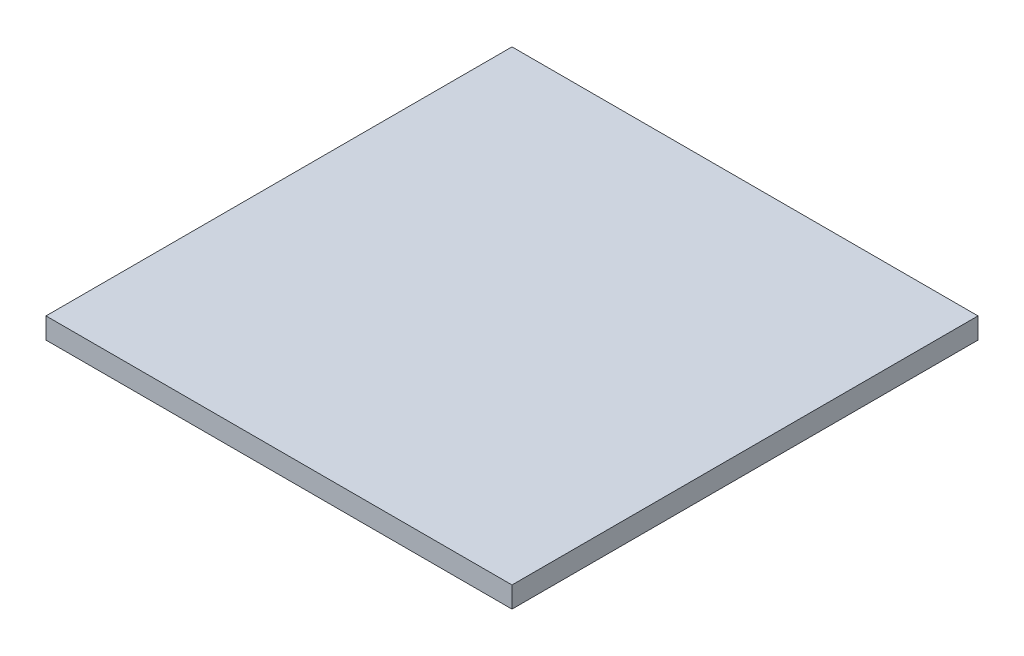
ISO-10303-21;
HEADER;
FILE_DESCRIPTION(('STEP AP214'),'2;1');
FILE_NAME('part.step','',(''),(''),'','','');
FILE_SCHEMA(('AUTOMOTIVE_DESIGN { 1 0 10303 214 1 1 1 1 }'));
ENDSEC;
DATA;
#1=APPLICATION_CONTEXT('core data for automotive mechanical design processes');
#2=APPLICATION_PROTOCOL_DEFINITION('international standard','automotive_design',2000,#1);
#3=PRODUCT_CONTEXT('',#1,'mechanical');
#4=PRODUCT('Part','Part','',(#3));
#5=PRODUCT_RELATED_PRODUCT_CATEGORY('part','',(#4));
#6=PRODUCT_DEFINITION_FORMATION('','',#4);
#7=PRODUCT_DEFINITION_CONTEXT('part definition',#1,'design');
#8=PRODUCT_DEFINITION('design','',#6,#7);
#9=PRODUCT_DEFINITION_SHAPE('','',#8);
#10=(LENGTH_UNIT() NAMED_UNIT(*) SI_UNIT(.MILLI.,.METRE.));
#11=(NAMED_UNIT(*) PLANE_ANGLE_UNIT() SI_UNIT($,.RADIAN.));
#12=(NAMED_UNIT(*) SI_UNIT($,.STERADIAN.) SOLID_ANGLE_UNIT());
#13=UNCERTAINTY_MEASURE_WITH_UNIT(LENGTH_MEASURE(1.E-05),#10,'distance_accuracy_value','');
#14=(GEOMETRIC_REPRESENTATION_CONTEXT(3) GLOBAL_UNCERTAINTY_ASSIGNED_CONTEXT((#13)) GLOBAL_UNIT_ASSIGNED_CONTEXT((#10,
#11,#12)) REPRESENTATION_CONTEXT('',''));
#15=CARTESIAN_POINT('',(0.,0.,0.));
#16=DIRECTION('',(0.,0.,1.));
#17=DIRECTION('',(1.,0.,0.));
#18=AXIS2_PLACEMENT_3D('',#15,#16,#17);
#19=CARTESIAN_POINT('',(200.,18.,-200.));
#20=DIRECTION('',(-1.,0.,0.));
#21=DIRECTION('',(0.,0.,1.));
#22=AXIS2_PLACEMENT_3D('',#19,#20,#21);
#23=PLANE('',#22);
#24=DIRECTION('',(0.,0.,-1.));
#25=VECTOR('',#24,1.);
#26=CARTESIAN_POINT('',(200.,0.,-200.));
#27=LINE('',#26,#25);
#28=CARTESIAN_POINT('',(200.,0.,200.));
#29=VERTEX_POINT('',#28);
#30=CARTESIAN_POINT('',(200.,0.,-200.));
#31=VERTEX_POINT('',#30);
#32=EDGE_CURVE('E96',#29,#31,#27,.T.);
#33=ORIENTED_EDGE('',*,*,#32,.T.);
#34=DIRECTION('',(0.,-1.,0.));
#35=VECTOR('',#34,1.);
#36=CARTESIAN_POINT('',(200.,18.,-200.));
#37=LINE('',#36,#35);
#38=CARTESIAN_POINT('',(200.,18.,-200.));
#39=VERTEX_POINT('',#38);
#40=EDGE_CURVE('E11',#39,#31,#37,.T.);
#41=ORIENTED_EDGE('',*,*,#40,.F.);
#42=DIRECTION('',(0.,0.,-1.));
#43=VECTOR('',#42,1.);
#44=CARTESIAN_POINT('',(200.,18.,-200.));
#45=LINE('',#44,#43);
#46=CARTESIAN_POINT('',(200.,18.,200.));
#47=VERTEX_POINT('',#46);
#48=EDGE_CURVE('E84',#47,#39,#45,.T.);
#49=ORIENTED_EDGE('',*,*,#48,.F.);
#50=DIRECTION('',(0.,-1.,0.));
#51=VECTOR('',#50,1.);
#52=CARTESIAN_POINT('',(200.,18.,200.));
#53=LINE('',#52,#51);
#54=EDGE_CURVE('E92',#47,#29,#53,.T.);
#55=ORIENTED_EDGE('',*,*,#54,.T.);
#56=EDGE_LOOP('',(#33,#41,#49,#55));
#57=FACE_BOUND('',#56,.T.);
#58=ADVANCED_FACE('F33',(#57),#23,.F.);
#59=CARTESIAN_POINT('',(-200.,18.,-200.));
#60=DIRECTION('',(0.,0.,1.));
#61=DIRECTION('',(1.,0.,0.));
#62=AXIS2_PLACEMENT_3D('',#59,#60,#61);
#63=PLANE('',#62);
#64=DIRECTION('',(-1.,0.,0.));
#65=VECTOR('',#64,1.);
#66=CARTESIAN_POINT('',(-200.,0.,-200.));
#67=LINE('',#66,#65);
#68=CARTESIAN_POINT('',(-200.,0.,-200.));
#69=VERTEX_POINT('',#68);
#70=EDGE_CURVE('E88',#31,#69,#67,.T.);
#71=ORIENTED_EDGE('',*,*,#70,.T.);
#72=DIRECTION('',(0.,-1.,0.));
#73=VECTOR('',#72,1.);
#74=CARTESIAN_POINT('',(-200.,18.,-200.));
#75=LINE('',#74,#73);
#76=CARTESIAN_POINT('',(-200.,18.,-200.));
#77=VERTEX_POINT('',#76);
#78=EDGE_CURVE('E41',#77,#69,#75,.T.);
#79=ORIENTED_EDGE('',*,*,#78,.F.);
#80=DIRECTION('',(-1.,0.,0.));
#81=VECTOR('',#80,1.);
#82=CARTESIAN_POINT('',(-200.,18.,-200.));
#83=LINE('',#82,#81);
#84=EDGE_CURVE('E79',#39,#77,#83,.T.);
#85=ORIENTED_EDGE('',*,*,#84,.F.);
#86=ORIENTED_EDGE('',*,*,#40,.T.);
#87=EDGE_LOOP('',(#71,#79,#85,#86));
#88=FACE_BOUND('',#87,.T.);
#89=ADVANCED_FACE('F87',(#88),#63,.F.);
#90=CARTESIAN_POINT('',(-200.,18.,-200.));
#91=DIRECTION('',(1.,0.,0.));
#92=DIRECTION('',(0.,0.,-1.));
#93=AXIS2_PLACEMENT_3D('',#90,#91,#92);
#94=PLANE('',#93);
#95=DIRECTION('',(0.,0.,1.));
#96=VECTOR('',#95,1.);
#97=CARTESIAN_POINT('',(-200.,0.,-200.));
#98=LINE('',#97,#96);
#99=CARTESIAN_POINT('',(-200.,0.,200.));
#100=VERTEX_POINT('',#99);
#101=EDGE_CURVE('E66',#69,#100,#98,.T.);
#102=ORIENTED_EDGE('',*,*,#101,.T.);
#103=DIRECTION('',(0.,-1.,0.));
#104=VECTOR('',#103,1.);
#105=CARTESIAN_POINT('',(-200.,18.,200.));
#106=LINE('',#105,#104);
#107=CARTESIAN_POINT('',(-200.,18.,200.));
#108=VERTEX_POINT('',#107);
#109=EDGE_CURVE('E89',#108,#100,#106,.T.);
#110=ORIENTED_EDGE('',*,*,#109,.F.);
#111=DIRECTION('',(0.,0.,1.));
#112=VECTOR('',#111,1.);
#113=CARTESIAN_POINT('',(-200.,18.,-200.));
#114=LINE('',#113,#112);
#115=EDGE_CURVE('E82',#77,#108,#114,.T.);
#116=ORIENTED_EDGE('',*,*,#115,.F.);
#117=ORIENTED_EDGE('',*,*,#78,.T.);
#118=EDGE_LOOP('',(#102,#110,#116,#117));
#119=FACE_BOUND('',#118,.T.);
#120=ADVANCED_FACE('F90',(#119),#94,.F.);
#121=CARTESIAN_POINT('',(-200.,18.,200.));
#122=DIRECTION('',(0.,0.,-1.));
#123=DIRECTION('',(-1.,0.,0.));
#124=AXIS2_PLACEMENT_3D('',#121,#122,#123);
#125=PLANE('',#124);
#126=DIRECTION('',(1.,0.,0.));
#127=VECTOR('',#126,1.);
#128=CARTESIAN_POINT('',(-200.,0.,200.));
#129=LINE('',#128,#127);
#130=EDGE_CURVE('E72',#100,#29,#129,.T.);
#131=ORIENTED_EDGE('',*,*,#130,.T.);
#132=ORIENTED_EDGE('',*,*,#54,.F.);
#133=DIRECTION('',(1.,0.,0.));
#134=VECTOR('',#133,1.);
#135=CARTESIAN_POINT('',(-200.,18.,200.));
#136=LINE('',#135,#134);
#137=EDGE_CURVE('E49',#108,#47,#136,.T.);
#138=ORIENTED_EDGE('',*,*,#137,.F.);
#139=ORIENTED_EDGE('',*,*,#109,.T.);
#140=EDGE_LOOP('',(#131,#132,#138,#139));
#141=FACE_BOUND('',#140,.T.);
#142=ADVANCED_FACE('F103',(#141),#125,.F.);
#143=CARTESIAN_POINT('',(0.,18.,0.));
#144=DIRECTION('',(0.,1.,0.));
#145=DIRECTION('',(0.,0.,1.));
#146=AXIS2_PLACEMENT_3D('',#143,#144,#145);
#147=PLANE('',#146);
#148=ORIENTED_EDGE('',*,*,#48,.T.);
#149=ORIENTED_EDGE('',*,*,#84,.T.);
#150=ORIENTED_EDGE('',*,*,#115,.T.);
#151=ORIENTED_EDGE('',*,*,#137,.T.);
#152=EDGE_LOOP('',(#148,#149,#150,#151));
#153=FACE_BOUND('',#152,.T.);
#154=ADVANCED_FACE('F80',(#153),#147,.T.);
#155=CARTESIAN_POINT('',(0.,0.,0.));
#156=DIRECTION('',(0.,1.,0.));
#157=DIRECTION('',(0.,0.,1.));
#158=AXIS2_PLACEMENT_3D('',#155,#156,#157);
#159=PLANE('',#158);
#160=ORIENTED_EDGE('',*,*,#32,.F.);
#161=ORIENTED_EDGE('',*,*,#130,.F.);
#162=ORIENTED_EDGE('',*,*,#101,.F.);
#163=ORIENTED_EDGE('',*,*,#70,.F.);
#164=EDGE_LOOP('',(#160,#161,#162,#163));
#165=FACE_BOUND('',#164,.T.);
#166=ADVANCED_FACE('F106',(#165),#159,.F.);
#167=CLOSED_SHELL('',(#58,#89,#120,#142,#154,#166));
#168=MANIFOLD_SOLID_BREP('B2',#167);
#169=ADVANCED_BREP_SHAPE_REPRESENTATION('',(#18,#168),#14);
#170=SHAPE_DEFINITION_REPRESENTATION(#9,#169);
ENDSEC;
END-ISO-10303-21;
